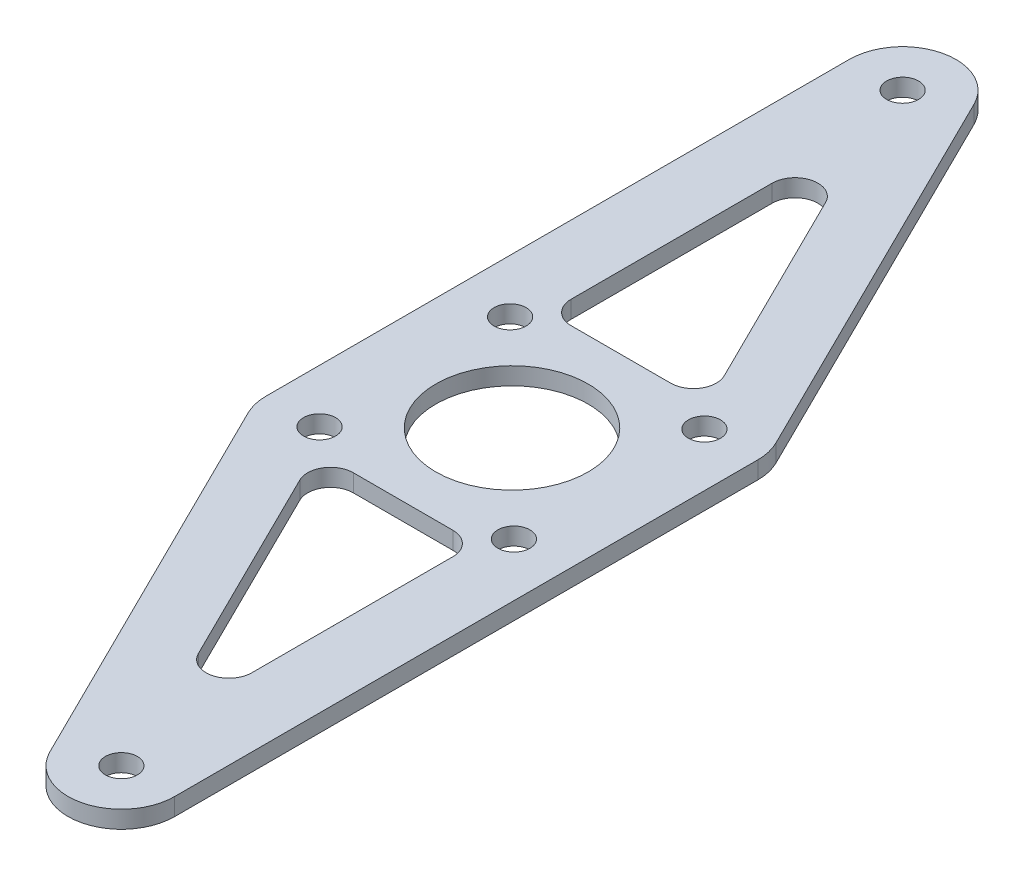
ISO-10303-21;
HEADER;
FILE_DESCRIPTION(('STEP AP214'),'2;1');
FILE_NAME('part.step','',(''),(''),'','','');
FILE_SCHEMA(('AUTOMOTIVE_DESIGN { 1 0 10303 214 1 1 1 1 }'));
ENDSEC;
DATA;
#1=APPLICATION_CONTEXT('core data for automotive mechanical design processes');
#2=APPLICATION_PROTOCOL_DEFINITION('international standard','automotive_design',2000,#1);
#3=PRODUCT_CONTEXT('',#1,'mechanical');
#4=PRODUCT('Part','Part','',(#3));
#5=PRODUCT_RELATED_PRODUCT_CATEGORY('part','',(#4));
#6=PRODUCT_DEFINITION_FORMATION('','',#4);
#7=PRODUCT_DEFINITION_CONTEXT('part definition',#1,'design');
#8=PRODUCT_DEFINITION('design','',#6,#7);
#9=PRODUCT_DEFINITION_SHAPE('','',#8);
#10=(LENGTH_UNIT() NAMED_UNIT(*) SI_UNIT(.MILLI.,.METRE.));
#11=(NAMED_UNIT(*) PLANE_ANGLE_UNIT() SI_UNIT($,.RADIAN.));
#12=(NAMED_UNIT(*) SI_UNIT($,.STERADIAN.) SOLID_ANGLE_UNIT());
#13=UNCERTAINTY_MEASURE_WITH_UNIT(LENGTH_MEASURE(1.E-05),#10,'distance_accuracy_value','');
#14=(GEOMETRIC_REPRESENTATION_CONTEXT(3) GLOBAL_UNCERTAINTY_ASSIGNED_CONTEXT((#13)) GLOBAL_UNIT_ASSIGNED_CONTEXT((#10,
#11,#12)) REPRESENTATION_CONTEXT('',''));
#15=CARTESIAN_POINT('',(0.,0.,0.));
#16=DIRECTION('',(0.,0.,1.));
#17=DIRECTION('',(1.,0.,0.));
#18=AXIS2_PLACEMENT_3D('',#15,#16,#17);
#19=CARTESIAN_POINT('',(-12.7500000000001,-2.286,-64.));
#20=DIRECTION('',(0.,1.,0.));
#21=DIRECTION('',(0.,0.,1.));
#22=AXIS2_PLACEMENT_3D('',#19,#20,#21);
#23=CYLINDRICAL_SURFACE('',#22,7.);
#24=CARTESIAN_POINT('',(-12.7500000000001,0.,-64.));
#25=DIRECTION('',(0.,1.,0.));
#26=DIRECTION('',(0.,0.,-1.));
#27=AXIS2_PLACEMENT_3D('',#24,#25,#26);
#28=CIRCLE('',#27,7.);
#29=CARTESIAN_POINT('',(-6.4768762361764,0.,-67.1061098248051));
#30=VERTEX_POINT('',#29);
#31=CARTESIAN_POINT('',(-19.7500000000001,0.,-63.9999999999993));
#32=VERTEX_POINT('',#31);
#33=EDGE_CURVE('E372',#30,#32,#28,.T.);
#34=ORIENTED_EDGE('',*,*,#33,.F.);
#35=DIRECTION('',(0.,1.,0.));
#36=VECTOR('',#35,1.);
#37=CARTESIAN_POINT('',(-6.4768762361764,-2.286,-67.1061098248051));
#38=LINE('',#37,#36);
#39=CARTESIAN_POINT('',(-6.4768762361764,-2.286,-67.1061098248051));
#40=VERTEX_POINT('',#39);
#41=EDGE_CURVE('E11',#40,#30,#38,.T.);
#42=ORIENTED_EDGE('',*,*,#41,.F.);
#43=CARTESIAN_POINT('',(-12.7500000000001,-2.286,-64.));
#44=DIRECTION('',(0.,1.,0.));
#45=DIRECTION('',(0.,0.,-1.));
#46=AXIS2_PLACEMENT_3D('',#43,#44,#45);
#47=CIRCLE('',#46,7.);
#48=CARTESIAN_POINT('',(-19.7500000000001,-2.286,-63.9999999999993));
#49=VERTEX_POINT('',#48);
#50=EDGE_CURVE('E376',#40,#49,#47,.T.);
#51=ORIENTED_EDGE('',*,*,#50,.T.);
#52=DIRECTION('',(0.,1.,0.));
#53=VECTOR('',#52,1.);
#54=CARTESIAN_POINT('',(-19.7500000000001,-2.286,-63.9999999999993));
#55=LINE('',#54,#53);
#56=EDGE_CURVE('E48',#49,#32,#55,.T.);
#57=ORIENTED_EDGE('',*,*,#56,.T.);
#58=EDGE_LOOP('',(#34,#42,#51,#57));
#59=FACE_BOUND('',#58,.T.);
#60=ADVANCED_FACE('F45',(#59),#23,.T.);
#61=CARTESIAN_POINT('',(-6.4768762361764,-2.286,-67.1061098248051));
#62=DIRECTION('',(0.89616053768905,0.,-0.44372997497225));
#63=DIRECTION('',(-0.44372997497225,0.,-0.89616053768905));
#64=AXIS2_PLACEMENT_3D('',#61,#62,#63);
#65=PLANE('',#64);
#66=DIRECTION('',(-0.44372997497225,0.,-0.89616053768905));
#67=VECTOR('',#66,1.);
#68=CARTESIAN_POINT('',(-6.4768762361764,0.,-67.1061098248051));
#69=LINE('',#68,#67);
#70=CARTESIAN_POINT('',(19.0231237638234,0.,-15.6061098248058));
#71=VERTEX_POINT('',#70);
#72=EDGE_CURVE('E381',#71,#30,#69,.T.);
#73=ORIENTED_EDGE('',*,*,#72,.F.);
#74=DIRECTION('',(0.,1.,0.));
#75=VECTOR('',#74,1.);
#76=CARTESIAN_POINT('',(19.0231237638234,-2.286,-15.6061098248058));
#77=LINE('',#76,#75);
#78=CARTESIAN_POINT('',(19.0231237638234,-2.286,-15.6061098248058));
#79=VERTEX_POINT('',#78);
#80=EDGE_CURVE('E54',#79,#71,#77,.T.);
#81=ORIENTED_EDGE('',*,*,#80,.F.);
#82=DIRECTION('',(-0.44372997497225,0.,-0.89616053768905));
#83=VECTOR('',#82,1.);
#84=CARTESIAN_POINT('',(-6.4768762361764,-2.286,-67.1061098248051));
#85=LINE('',#84,#83);
#86=EDGE_CURVE('E405',#79,#40,#85,.T.);
#87=ORIENTED_EDGE('',*,*,#86,.T.);
#88=ORIENTED_EDGE('',*,*,#41,.T.);
#89=EDGE_LOOP('',(#73,#81,#87,#88));
#90=FACE_BOUND('',#89,.T.);
#91=ADVANCED_FACE('F468',(#90),#65,.T.);
#92=CARTESIAN_POINT('',(12.7499999999999,-2.286,-12.5));
#93=DIRECTION('',(0.,1.,0.));
#94=DIRECTION('',(0.,0.,1.));
#95=AXIS2_PLACEMENT_3D('',#92,#93,#94);
#96=CYLINDRICAL_SURFACE('',#95,7.00000000000016);
#97=CARTESIAN_POINT('',(12.7499999999999,0.,-12.5));
#98=DIRECTION('',(0.,1.,0.));
#99=DIRECTION('',(0.,0.,-1.));
#100=AXIS2_PLACEMENT_3D('',#97,#98,#99);
#101=CIRCLE('',#100,7.00000000000016);
#102=CARTESIAN_POINT('',(19.75,0.,-12.5));
#103=VERTEX_POINT('',#102);
#104=EDGE_CURVE('E432',#103,#71,#101,.T.);
#105=ORIENTED_EDGE('',*,*,#104,.F.);
#106=DIRECTION('',(0.,1.,0.));
#107=VECTOR('',#106,1.);
#108=CARTESIAN_POINT('',(19.75,-2.286,-12.5));
#109=LINE('',#108,#107);
#110=CARTESIAN_POINT('',(19.75,-2.286,-12.5));
#111=VERTEX_POINT('',#110);
#112=EDGE_CURVE('E441',#111,#103,#109,.T.);
#113=ORIENTED_EDGE('',*,*,#112,.F.);
#114=CARTESIAN_POINT('',(12.7499999999999,-2.286,-12.5));
#115=DIRECTION('',(0.,1.,0.));
#116=DIRECTION('',(0.,0.,-1.));
#117=AXIS2_PLACEMENT_3D('',#114,#115,#116);
#118=CIRCLE('',#117,7.00000000000016);
#119=EDGE_CURVE('E401',#111,#79,#118,.T.);
#120=ORIENTED_EDGE('',*,*,#119,.T.);
#121=ORIENTED_EDGE('',*,*,#80,.T.);
#122=EDGE_LOOP('',(#105,#113,#120,#121));
#123=FACE_BOUND('',#122,.T.);
#124=ADVANCED_FACE('F488',(#123),#96,.T.);
#125=CARTESIAN_POINT('',(19.75,-2.286,-12.5));
#126=DIRECTION('',(1.,0.,0.));
#127=DIRECTION('',(0.,0.,-1.));
#128=AXIS2_PLACEMENT_3D('',#125,#126,#127);
#129=PLANE('',#128);
#130=DIRECTION('',(0.,0.,-1.));
#131=VECTOR('',#130,1.);
#132=CARTESIAN_POINT('',(19.75,0.,-12.5));
#133=LINE('',#132,#131);
#134=CARTESIAN_POINT('',(19.75,0.,63.9999999999993));
#135=VERTEX_POINT('',#134);
#136=EDGE_CURVE('E428',#135,#103,#133,.T.);
#137=ORIENTED_EDGE('',*,*,#136,.F.);
#138=DIRECTION('',(0.,1.,0.));
#139=VECTOR('',#138,1.);
#140=CARTESIAN_POINT('',(19.75,-2.286,63.9999999999993));
#141=LINE('',#140,#139);
#142=CARTESIAN_POINT('',(19.75,-2.286,63.9999999999993));
#143=VERTEX_POINT('',#142);
#144=EDGE_CURVE('E444',#143,#135,#141,.T.);
#145=ORIENTED_EDGE('',*,*,#144,.F.);
#146=DIRECTION('',(0.,0.,-1.));
#147=VECTOR('',#146,1.);
#148=CARTESIAN_POINT('',(19.75,-2.286,-12.5));
#149=LINE('',#148,#147);
#150=EDGE_CURVE('E397',#143,#111,#149,.T.);
#151=ORIENTED_EDGE('',*,*,#150,.T.);
#152=ORIENTED_EDGE('',*,*,#112,.T.);
#153=EDGE_LOOP('',(#137,#145,#151,#152));
#154=FACE_BOUND('',#153,.T.);
#155=ADVANCED_FACE('F486',(#154),#129,.T.);
#156=CARTESIAN_POINT('',(12.7499999999999,-2.286,63.9999999999993));
#157=DIRECTION('',(0.,1.,0.));
#158=DIRECTION('',(0.,0.,1.));
#159=AXIS2_PLACEMENT_3D('',#156,#157,#158);
#160=CYLINDRICAL_SURFACE('',#159,7.00000000000016);
#161=CARTESIAN_POINT('',(12.7499999999999,0.,63.9999999999993));
#162=DIRECTION('',(0.,1.,0.));
#163=DIRECTION('',(0.,0.,1.));
#164=AXIS2_PLACEMENT_3D('',#161,#162,#163);
#165=CIRCLE('',#164,7.00000000000016);
#166=CARTESIAN_POINT('',(6.4768762361764,0.,67.1061098248051));
#167=VERTEX_POINT('',#166);
#168=EDGE_CURVE('E424',#167,#135,#165,.T.);
#169=ORIENTED_EDGE('',*,*,#168,.F.);
#170=DIRECTION('',(0.,1.,0.));
#171=VECTOR('',#170,1.);
#172=CARTESIAN_POINT('',(6.4768762361764,-2.286,67.1061098248051));
#173=LINE('',#172,#171);
#174=CARTESIAN_POINT('',(6.4768762361764,-2.286,67.1061098248051));
#175=VERTEX_POINT('',#174);
#176=EDGE_CURVE('E447',#175,#167,#173,.T.);
#177=ORIENTED_EDGE('',*,*,#176,.F.);
#178=CARTESIAN_POINT('',(12.7499999999999,-2.286,63.9999999999993));
#179=DIRECTION('',(0.,1.,0.));
#180=DIRECTION('',(0.,0.,1.));
#181=AXIS2_PLACEMENT_3D('',#178,#179,#180);
#182=CIRCLE('',#181,7.00000000000016);
#183=EDGE_CURVE('E393',#175,#143,#182,.T.);
#184=ORIENTED_EDGE('',*,*,#183,.T.);
#185=ORIENTED_EDGE('',*,*,#144,.T.);
#186=EDGE_LOOP('',(#169,#177,#184,#185));
#187=FACE_BOUND('',#186,.T.);
#188=ADVANCED_FACE('F482',(#187),#160,.T.);
#189=CARTESIAN_POINT('',(6.4768762361764,-2.286,67.1061098248051));
#190=DIRECTION('',(-0.89616053768905,0.,0.44372997497225));
#191=DIRECTION('',(0.44372997497225,0.,0.89616053768905));
#192=AXIS2_PLACEMENT_3D('',#189,#190,#191);
#193=PLANE('',#192);
#194=DIRECTION('',(0.44372997497225,0.,0.89616053768905));
#195=VECTOR('',#194,1.);
#196=CARTESIAN_POINT('',(6.4768762361764,0.,67.1061098248051));
#197=LINE('',#196,#195);
#198=CARTESIAN_POINT('',(-19.0231237638234,0.,15.6061098248058));
#199=VERTEX_POINT('',#198);
#200=EDGE_CURVE('E420',#199,#167,#197,.T.);
#201=ORIENTED_EDGE('',*,*,#200,.F.);
#202=DIRECTION('',(0.,1.,0.));
#203=VECTOR('',#202,1.);
#204=CARTESIAN_POINT('',(-19.0231237638234,-2.286,15.6061098248058));
#205=LINE('',#204,#203);
#206=CARTESIAN_POINT('',(-19.0231237638234,-2.286,15.6061098248058));
#207=VERTEX_POINT('',#206);
#208=EDGE_CURVE('E450',#207,#199,#205,.T.);
#209=ORIENTED_EDGE('',*,*,#208,.F.);
#210=DIRECTION('',(0.44372997497225,0.,0.89616053768905));
#211=VECTOR('',#210,1.);
#212=CARTESIAN_POINT('',(6.4768762361764,-2.286,67.1061098248051));
#213=LINE('',#212,#211);
#214=EDGE_CURVE('E389',#207,#175,#213,.T.);
#215=ORIENTED_EDGE('',*,*,#214,.T.);
#216=ORIENTED_EDGE('',*,*,#176,.T.);
#217=EDGE_LOOP('',(#201,#209,#215,#216));
#218=FACE_BOUND('',#217,.T.);
#219=ADVANCED_FACE('F480',(#218),#193,.T.);
#220=CARTESIAN_POINT('',(-12.7499999999999,-2.286,12.5));
#221=DIRECTION('',(0.,1.,0.));
#222=DIRECTION('',(0.,0.,1.));
#223=AXIS2_PLACEMENT_3D('',#220,#221,#222);
#224=CYLINDRICAL_SURFACE('',#223,7.00000000000016);
#225=CARTESIAN_POINT('',(-12.7499999999999,0.,12.5));
#226=DIRECTION('',(0.,1.,0.));
#227=DIRECTION('',(0.,0.,-1.));
#228=AXIS2_PLACEMENT_3D('',#225,#226,#227);
#229=CIRCLE('',#228,7.00000000000016);
#230=CARTESIAN_POINT('',(-19.7500000000001,0.,12.5));
#231=VERTEX_POINT('',#230);
#232=EDGE_CURVE('E416',#231,#199,#229,.T.);
#233=ORIENTED_EDGE('',*,*,#232,.F.);
#234=DIRECTION('',(0.,1.,0.));
#235=VECTOR('',#234,1.);
#236=CARTESIAN_POINT('',(-19.7500000000001,-2.286,12.5));
#237=LINE('',#236,#235);
#238=CARTESIAN_POINT('',(-19.7500000000001,-2.286,12.5));
#239=VERTEX_POINT('',#238);
#240=EDGE_CURVE('E452',#239,#231,#237,.T.);
#241=ORIENTED_EDGE('',*,*,#240,.F.);
#242=CARTESIAN_POINT('',(-12.7499999999999,-2.286,12.5));
#243=DIRECTION('',(0.,1.,0.));
#244=DIRECTION('',(0.,0.,-1.));
#245=AXIS2_PLACEMENT_3D('',#242,#243,#244);
#246=CIRCLE('',#245,7.00000000000016);
#247=EDGE_CURVE('E385',#239,#207,#246,.T.);
#248=ORIENTED_EDGE('',*,*,#247,.T.);
#249=ORIENTED_EDGE('',*,*,#208,.T.);
#250=EDGE_LOOP('',(#233,#241,#248,#249));
#251=FACE_BOUND('',#250,.T.);
#252=ADVANCED_FACE('F476',(#251),#224,.T.);
#253=CARTESIAN_POINT('',(-19.7500000000001,-2.286,12.5));
#254=DIRECTION('',(-1.,0.,0.));
#255=DIRECTION('',(0.,0.,1.));
#256=AXIS2_PLACEMENT_3D('',#253,#254,#255);
#257=PLANE('',#256);
#258=DIRECTION('',(0.,0.,1.));
#259=VECTOR('',#258,1.);
#260=CARTESIAN_POINT('',(-19.7500000000001,0.,12.5));
#261=LINE('',#260,#259);
#262=EDGE_CURVE('E412',#32,#231,#261,.T.);
#263=ORIENTED_EDGE('',*,*,#262,.F.);
#264=ORIENTED_EDGE('',*,*,#56,.F.);
#265=DIRECTION('',(0.,0.,1.));
#266=VECTOR('',#265,1.);
#267=CARTESIAN_POINT('',(-19.7500000000001,-2.286,12.5));
#268=LINE('',#267,#266);
#269=EDGE_CURVE('E380',#49,#239,#268,.T.);
#270=ORIENTED_EDGE('',*,*,#269,.T.);
#271=ORIENTED_EDGE('',*,*,#240,.T.);
#272=EDGE_LOOP('',(#263,#264,#270,#271));
#273=FACE_BOUND('',#272,.T.);
#274=ADVANCED_FACE('F462',(#273),#257,.T.);
#275=CARTESIAN_POINT('',(-12.7500000000001,-2.286,-64.));
#276=DIRECTION('',(0.,-1.,0.));
#277=DIRECTION('',(0.,0.,-1.));
#278=AXIS2_PLACEMENT_3D('',#275,#276,#277);
#279=PLANE('',#278);
#280=CARTESIAN_POINT('',(7.75000000000005,-2.286,44.8874694819171));
#281=DIRECTION('',(0.,1.,0.));
#282=DIRECTION('',(0.,0.,-1.));
#283=AXIS2_PLACEMENT_3D('',#280,#281,#282);
#284=CIRCLE('',#283,3.);
#285=CARTESIAN_POINT('',(5.0615183869329,-2.286,46.2186594068339));
#286=VERTEX_POINT('',#285);
#287=CARTESIAN_POINT('',(10.75,-2.286,44.8874694819171));
#288=VERTEX_POINT('',#287);
#289=EDGE_CURVE('E185',#286,#288,#284,.T.);
#290=ORIENTED_EDGE('',*,*,#289,.T.);
#291=DIRECTION('',(0.,0.,-1.));
#292=VECTOR('',#291,1.);
#293=CARTESIAN_POINT('',(10.75,-2.286,18.5));
#294=LINE('',#293,#292);
#295=CARTESIAN_POINT('',(10.75,-2.286,18.5));
#296=VERTEX_POINT('',#295);
#297=EDGE_CURVE('E195',#288,#296,#294,.T.);
#298=ORIENTED_EDGE('',*,*,#297,.T.);
#299=CARTESIAN_POINT('',(7.75000000000004,-2.286,18.5));
#300=DIRECTION('',(0.,1.,0.));
#301=DIRECTION('',(0.,0.,1.));
#302=AXIS2_PLACEMENT_3D('',#299,#300,#301);
#303=CIRCLE('',#302,3.);
#304=CARTESIAN_POINT('',(7.75000000000004,-2.286,15.5));
#305=VERTEX_POINT('',#304);
#306=EDGE_CURVE('E62',#296,#305,#303,.T.);
#307=ORIENTED_EDGE('',*,*,#306,.T.);
#308=DIRECTION('',(-1.,0.,0.));
#309=VECTOR('',#308,1.);
#310=CARTESIAN_POINT('',(-5.31564022891046,-2.286,15.5));
#311=LINE('',#310,#309);
#312=CARTESIAN_POINT('',(-5.31564022891046,-2.286,15.5));
#313=VERTEX_POINT('',#312);
#314=EDGE_CURVE('E214',#305,#313,#311,.T.);
#315=ORIENTED_EDGE('',*,*,#314,.T.);
#316=CARTESIAN_POINT('',(-5.31564022891046,-2.286,18.5));
#317=DIRECTION('',(0.,1.,0.));
#318=DIRECTION('',(0.,0.,1.));
#319=AXIS2_PLACEMENT_3D('',#316,#317,#318);
#320=CIRCLE('',#319,3.);
#321=CARTESIAN_POINT('',(-8.00412184197761,-2.286,19.8311899249167));
#322=VERTEX_POINT('',#321);
#323=EDGE_CURVE('E218',#313,#322,#320,.T.);
#324=ORIENTED_EDGE('',*,*,#323,.T.);
#325=DIRECTION('',(0.44372997497225,0.,0.89616053768905));
#326=VECTOR('',#325,1.);
#327=CARTESIAN_POINT('',(5.0615183869329,-2.286,46.2186594068339));
#328=LINE('',#327,#326);
#329=EDGE_CURVE('E192',#322,#286,#328,.T.);
#330=ORIENTED_EDGE('',*,*,#329,.T.);
#331=EDGE_LOOP('',(#290,#298,#307,#315,#324,#330));
#332=FACE_BOUND('',#331,.T.);
#333=CARTESIAN_POINT('',(-7.75000000000004,-2.286,-44.8874694819171));
#334=DIRECTION('',(0.,1.,0.));
#335=DIRECTION('',(0.,0.,-1.));
#336=AXIS2_PLACEMENT_3D('',#333,#334,#335);
#337=CIRCLE('',#336,3.);
#338=CARTESIAN_POINT('',(-5.06151838693289,-2.286,-46.2186594068339));
#339=VERTEX_POINT('',#338);
#340=CARTESIAN_POINT('',(-10.75,-2.286,-44.8874694819171));
#341=VERTEX_POINT('',#340);
#342=EDGE_CURVE('E254',#339,#341,#337,.T.);
#343=ORIENTED_EDGE('',*,*,#342,.T.);
#344=DIRECTION('',(0.,0.,1.));
#345=VECTOR('',#344,1.);
#346=CARTESIAN_POINT('',(-10.75,-2.286,-18.5));
#347=LINE('',#346,#345);
#348=CARTESIAN_POINT('',(-10.75,-2.286,-18.5));
#349=VERTEX_POINT('',#348);
#350=EDGE_CURVE('E258',#341,#349,#347,.T.);
#351=ORIENTED_EDGE('',*,*,#350,.T.);
#352=CARTESIAN_POINT('',(-7.75000000000004,-2.286,-18.5));
#353=DIRECTION('',(0.,1.,0.));
#354=DIRECTION('',(0.,0.,1.));
#355=AXIS2_PLACEMENT_3D('',#352,#353,#354);
#356=CIRCLE('',#355,3.);
#357=CARTESIAN_POINT('',(-7.75000000000004,-2.286,-15.5));
#358=VERTEX_POINT('',#357);
#359=EDGE_CURVE('E263',#349,#358,#356,.T.);
#360=ORIENTED_EDGE('',*,*,#359,.T.);
#361=DIRECTION('',(1.,0.,0.));
#362=VECTOR('',#361,1.);
#363=CARTESIAN_POINT('',(5.31564022891046,-2.286,-15.5));
#364=LINE('',#363,#362);
#365=CARTESIAN_POINT('',(5.31564022891046,-2.286,-15.5));
#366=VERTEX_POINT('',#365);
#367=EDGE_CURVE('E267',#358,#366,#364,.T.);
#368=ORIENTED_EDGE('',*,*,#367,.T.);
#369=CARTESIAN_POINT('',(5.31564022891046,-2.286,-18.5));
#370=DIRECTION('',(0.,1.,0.));
#371=DIRECTION('',(0.,0.,1.));
#372=AXIS2_PLACEMENT_3D('',#369,#370,#371);
#373=CIRCLE('',#372,3.);
#374=CARTESIAN_POINT('',(8.00412184197761,-2.286,-19.8311899249167));
#375=VERTEX_POINT('',#374);
#376=EDGE_CURVE('E271',#366,#375,#373,.T.);
#377=ORIENTED_EDGE('',*,*,#376,.T.);
#378=DIRECTION('',(-0.443729974972249,0.,-0.89616053768905));
#379=VECTOR('',#378,1.);
#380=CARTESIAN_POINT('',(-5.06151838693289,-2.286,-46.2186594068339));
#381=LINE('',#380,#379);
#382=EDGE_CURVE('E275',#375,#339,#381,.T.);
#383=ORIENTED_EDGE('',*,*,#382,.T.);
#384=EDGE_LOOP('',(#343,#351,#360,#368,#377,#383));
#385=FACE_BOUND('',#384,.T.);
#386=CARTESIAN_POINT('',(0.,-2.286,0.));
#387=DIRECTION('',(0.,1.,0.));
#388=DIRECTION('',(0.,0.,1.));
#389=AXIS2_PLACEMENT_3D('',#386,#387,#388);
#390=CIRCLE('',#389,10.);
#391=CARTESIAN_POINT('',(0.,-2.286,10.));
#392=VERTEX_POINT('',#391);
#393=EDGE_CURVE('E320',#392,#392,#390,.T.);
#394=ORIENTED_EDGE('',*,*,#393,.T.);
#395=EDGE_LOOP('',(#394));
#396=FACE_BOUND('',#395,.T.);
#397=CARTESIAN_POINT('',(-12.75,-2.286,12.5));
#398=DIRECTION('',(0.,1.,0.));
#399=DIRECTION('',(0.,0.,1.));
#400=AXIS2_PLACEMENT_3D('',#397,#398,#399);
#401=CIRCLE('',#400,2.1);
#402=CARTESIAN_POINT('',(-12.75,-2.286,14.6));
#403=VERTEX_POINT('',#402);
#404=EDGE_CURVE('E328',#403,#403,#401,.T.);
#405=ORIENTED_EDGE('',*,*,#404,.T.);
#406=EDGE_LOOP('',(#405));
#407=FACE_BOUND('',#406,.T.);
#408=CARTESIAN_POINT('',(12.7500000000001,-2.286,64.));
#409=DIRECTION('',(0.,1.,0.));
#410=DIRECTION('',(0.,0.,1.));
#411=AXIS2_PLACEMENT_3D('',#408,#409,#410);
#412=CIRCLE('',#411,2.1);
#413=CARTESIAN_POINT('',(12.7500000000001,-2.286,66.1));
#414=VERTEX_POINT('',#413);
#415=EDGE_CURVE('E336',#414,#414,#412,.T.);
#416=ORIENTED_EDGE('',*,*,#415,.T.);
#417=EDGE_LOOP('',(#416));
#418=FACE_BOUND('',#417,.T.);
#419=CARTESIAN_POINT('',(12.75,-2.286,12.5));
#420=DIRECTION('',(0.,1.,0.));
#421=DIRECTION('',(0.,0.,1.));
#422=AXIS2_PLACEMENT_3D('',#419,#420,#421);
#423=CIRCLE('',#422,2.1);
#424=CARTESIAN_POINT('',(12.75,-2.286,14.6));
#425=VERTEX_POINT('',#424);
#426=EDGE_CURVE('E344',#425,#425,#423,.T.);
#427=ORIENTED_EDGE('',*,*,#426,.T.);
#428=EDGE_LOOP('',(#427));
#429=FACE_BOUND('',#428,.T.);
#430=CARTESIAN_POINT('',(12.75,-2.286,-12.5));
#431=DIRECTION('',(0.,1.,0.));
#432=DIRECTION('',(0.,0.,1.));
#433=AXIS2_PLACEMENT_3D('',#430,#431,#432);
#434=CIRCLE('',#433,2.1);
#435=CARTESIAN_POINT('',(12.75,-2.286,-10.4));
#436=VERTEX_POINT('',#435);
#437=EDGE_CURVE('E352',#436,#436,#434,.T.);
#438=ORIENTED_EDGE('',*,*,#437,.T.);
#439=EDGE_LOOP('',(#438));
#440=FACE_BOUND('',#439,.T.);
#441=CARTESIAN_POINT('',(-12.75,-2.286,-12.5));
#442=DIRECTION('',(0.,1.,0.));
#443=DIRECTION('',(0.,0.,1.));
#444=AXIS2_PLACEMENT_3D('',#441,#442,#443);
#445=CIRCLE('',#444,2.1);
#446=CARTESIAN_POINT('',(-12.75,-2.286,-10.4));
#447=VERTEX_POINT('',#446);
#448=EDGE_CURVE('E360',#447,#447,#445,.T.);
#449=ORIENTED_EDGE('',*,*,#448,.T.);
#450=EDGE_LOOP('',(#449));
#451=FACE_BOUND('',#450,.T.);
#452=CARTESIAN_POINT('',(-12.7500000000001,-2.286,-64.));
#453=DIRECTION('',(0.,1.,0.));
#454=DIRECTION('',(0.,0.,1.));
#455=AXIS2_PLACEMENT_3D('',#452,#453,#454);
#456=CIRCLE('',#455,2.1);
#457=CARTESIAN_POINT('',(-12.7500000000001,-2.286,-61.9));
#458=VERTEX_POINT('',#457);
#459=EDGE_CURVE('E368',#458,#458,#456,.T.);
#460=ORIENTED_EDGE('',*,*,#459,.T.);
#461=EDGE_LOOP('',(#460));
#462=FACE_BOUND('',#461,.T.);
#463=ORIENTED_EDGE('',*,*,#50,.F.);
#464=ORIENTED_EDGE('',*,*,#86,.F.);
#465=ORIENTED_EDGE('',*,*,#119,.F.);
#466=ORIENTED_EDGE('',*,*,#150,.F.);
#467=ORIENTED_EDGE('',*,*,#183,.F.);
#468=ORIENTED_EDGE('',*,*,#214,.F.);
#469=ORIENTED_EDGE('',*,*,#247,.F.);
#470=ORIENTED_EDGE('',*,*,#269,.F.);
#471=EDGE_LOOP('',(#463,#464,#465,#466,#467,#468,#469,#470));
#472=FACE_BOUND('',#471,.T.);
#473=ADVANCED_FACE('F200',(#332,#385,#396,#407,#418,#429,#440,#451,#462,#472),#279,.T.);
#474=CARTESIAN_POINT('',(-12.7500000000001,0.,-64.));
#475=DIRECTION('',(0.,-1.,0.));
#476=DIRECTION('',(0.,0.,-1.));
#477=AXIS2_PLACEMENT_3D('',#474,#475,#476);
#478=PLANE('',#477);
#479=DIRECTION('',(0.,0.,-1.));
#480=VECTOR('',#479,1.);
#481=CARTESIAN_POINT('',(10.75,0.,18.5));
#482=LINE('',#481,#480);
#483=CARTESIAN_POINT('',(10.75,0.,44.8874694819171));
#484=VERTEX_POINT('',#483);
#485=CARTESIAN_POINT('',(10.75,0.,18.5));
#486=VERTEX_POINT('',#485);
#487=EDGE_CURVE('E225',#484,#486,#482,.T.);
#488=ORIENTED_EDGE('',*,*,#487,.F.);
#489=CARTESIAN_POINT('',(7.75000000000005,0.,44.8874694819171));
#490=DIRECTION('',(0.,1.,0.));
#491=DIRECTION('',(0.,0.,-1.));
#492=AXIS2_PLACEMENT_3D('',#489,#490,#491);
#493=CIRCLE('',#492,3.);
#494=CARTESIAN_POINT('',(5.0615183869329,0.,46.2186594068339));
#495=VERTEX_POINT('',#494);
#496=EDGE_CURVE('E70',#495,#484,#493,.T.);
#497=ORIENTED_EDGE('',*,*,#496,.F.);
#498=DIRECTION('',(0.44372997497225,0.,0.89616053768905));
#499=VECTOR('',#498,1.);
#500=CARTESIAN_POINT('',(5.0615183869329,0.,46.2186594068339));
#501=LINE('',#500,#499);
#502=CARTESIAN_POINT('',(-8.00412184197761,0.,19.8311899249167));
#503=VERTEX_POINT('',#502);
#504=EDGE_CURVE('E205',#503,#495,#501,.T.);
#505=ORIENTED_EDGE('',*,*,#504,.F.);
#506=CARTESIAN_POINT('',(-5.31564022891046,0.,18.5));
#507=DIRECTION('',(0.,1.,0.));
#508=DIRECTION('',(0.,0.,1.));
#509=AXIS2_PLACEMENT_3D('',#506,#507,#508);
#510=CIRCLE('',#509,3.);
#511=CARTESIAN_POINT('',(-5.31564022891046,0.,15.5));
#512=VERTEX_POINT('',#511);
#513=EDGE_CURVE('E209',#512,#503,#510,.T.);
#514=ORIENTED_EDGE('',*,*,#513,.F.);
#515=DIRECTION('',(-1.,0.,0.));
#516=VECTOR('',#515,1.);
#517=CARTESIAN_POINT('',(-5.31564022891046,0.,15.5));
#518=LINE('',#517,#516);
#519=CARTESIAN_POINT('',(7.75000000000004,0.,15.5));
#520=VERTEX_POINT('',#519);
#521=EDGE_CURVE('E232',#520,#512,#518,.T.);
#522=ORIENTED_EDGE('',*,*,#521,.F.);
#523=CARTESIAN_POINT('',(7.75000000000004,0.,18.5));
#524=DIRECTION('',(0.,1.,0.));
#525=DIRECTION('',(0.,0.,1.));
#526=AXIS2_PLACEMENT_3D('',#523,#524,#525);
#527=CIRCLE('',#526,3.);
#528=EDGE_CURVE('E228',#486,#520,#527,.T.);
#529=ORIENTED_EDGE('',*,*,#528,.F.);
#530=EDGE_LOOP('',(#488,#497,#505,#514,#522,#529));
#531=FACE_BOUND('',#530,.T.);
#532=DIRECTION('',(0.,0.,1.));
#533=VECTOR('',#532,1.);
#534=CARTESIAN_POINT('',(-10.75,0.,-18.5));
#535=LINE('',#534,#533);
#536=CARTESIAN_POINT('',(-10.75,0.,-44.8874694819171));
#537=VERTEX_POINT('',#536);
#538=CARTESIAN_POINT('',(-10.75,0.,-18.5));
#539=VERTEX_POINT('',#538);
#540=EDGE_CURVE('E282',#537,#539,#535,.T.);
#541=ORIENTED_EDGE('',*,*,#540,.F.);
#542=CARTESIAN_POINT('',(-7.75000000000004,0.,-44.8874694819171));
#543=DIRECTION('',(0.,1.,0.));
#544=DIRECTION('',(0.,0.,-1.));
#545=AXIS2_PLACEMENT_3D('',#542,#543,#544);
#546=CIRCLE('',#545,3.);
#547=CARTESIAN_POINT('',(-5.06151838693289,0.,-46.2186594068339));
#548=VERTEX_POINT('',#547);
#549=EDGE_CURVE('E242',#548,#537,#546,.T.);
#550=ORIENTED_EDGE('',*,*,#549,.F.);
#551=DIRECTION('',(-0.443729974972249,0.,-0.89616053768905));
#552=VECTOR('',#551,1.);
#553=CARTESIAN_POINT('',(-5.06151838693289,0.,-46.2186594068339));
#554=LINE('',#553,#552);
#555=CARTESIAN_POINT('',(8.00412184197761,0.,-19.8311899249167));
#556=VERTEX_POINT('',#555);
#557=EDGE_CURVE('E259',#556,#548,#554,.T.);
#558=ORIENTED_EDGE('',*,*,#557,.F.);
#559=CARTESIAN_POINT('',(5.31564022891046,0.,-18.5));
#560=DIRECTION('',(0.,1.,0.));
#561=DIRECTION('',(0.,0.,1.));
#562=AXIS2_PLACEMENT_3D('',#559,#560,#561);
#563=CIRCLE('',#562,3.);
#564=CARTESIAN_POINT('',(5.31564022891046,0.,-15.5));
#565=VERTEX_POINT('',#564);
#566=EDGE_CURVE('E294',#565,#556,#563,.T.);
#567=ORIENTED_EDGE('',*,*,#566,.F.);
#568=DIRECTION('',(1.,0.,0.));
#569=VECTOR('',#568,1.);
#570=CARTESIAN_POINT('',(5.31564022891046,0.,-15.5));
#571=LINE('',#570,#569);
#572=CARTESIAN_POINT('',(-7.75000000000004,0.,-15.5));
#573=VERTEX_POINT('',#572);
#574=EDGE_CURVE('E290',#573,#565,#571,.T.);
#575=ORIENTED_EDGE('',*,*,#574,.F.);
#576=CARTESIAN_POINT('',(-7.75000000000004,0.,-18.5));
#577=DIRECTION('',(0.,1.,0.));
#578=DIRECTION('',(0.,0.,1.));
#579=AXIS2_PLACEMENT_3D('',#576,#577,#578);
#580=CIRCLE('',#579,3.);
#581=EDGE_CURVE('E286',#539,#573,#580,.T.);
#582=ORIENTED_EDGE('',*,*,#581,.F.);
#583=EDGE_LOOP('',(#541,#550,#558,#567,#575,#582));
#584=FACE_BOUND('',#583,.T.);
#585=CARTESIAN_POINT('',(0.,0.,0.));
#586=DIRECTION('',(0.,1.,0.));
#587=DIRECTION('',(0.,0.,1.));
#588=AXIS2_PLACEMENT_3D('',#585,#586,#587);
#589=CIRCLE('',#588,10.);
#590=CARTESIAN_POINT('',(0.,0.,10.));
#591=VERTEX_POINT('',#590);
#592=EDGE_CURVE('E304',#591,#591,#589,.T.);
#593=ORIENTED_EDGE('',*,*,#592,.F.);
#594=EDGE_LOOP('',(#593));
#595=FACE_BOUND('',#594,.T.);
#596=CARTESIAN_POINT('',(-12.75,0.,12.5));
#597=DIRECTION('',(0.,1.,0.));
#598=DIRECTION('',(0.,0.,1.));
#599=AXIS2_PLACEMENT_3D('',#596,#597,#598);
#600=CIRCLE('',#599,2.1);
#601=CARTESIAN_POINT('',(-12.75,0.,14.6));
#602=VERTEX_POINT('',#601);
#603=EDGE_CURVE('E324',#602,#602,#600,.T.);
#604=ORIENTED_EDGE('',*,*,#603,.F.);
#605=EDGE_LOOP('',(#604));
#606=FACE_BOUND('',#605,.T.);
#607=CARTESIAN_POINT('',(12.7500000000001,0.,64.));
#608=DIRECTION('',(0.,1.,0.));
#609=DIRECTION('',(0.,0.,1.));
#610=AXIS2_PLACEMENT_3D('',#607,#608,#609);
#611=CIRCLE('',#610,2.1);
#612=CARTESIAN_POINT('',(12.7500000000001,0.,66.1));
#613=VERTEX_POINT('',#612);
#614=EDGE_CURVE('E332',#613,#613,#611,.T.);
#615=ORIENTED_EDGE('',*,*,#614,.F.);
#616=EDGE_LOOP('',(#615));
#617=FACE_BOUND('',#616,.T.);
#618=CARTESIAN_POINT('',(12.75,0.,12.5));
#619=DIRECTION('',(0.,1.,0.));
#620=DIRECTION('',(0.,0.,1.));
#621=AXIS2_PLACEMENT_3D('',#618,#619,#620);
#622=CIRCLE('',#621,2.1);
#623=CARTESIAN_POINT('',(12.75,0.,14.6));
#624=VERTEX_POINT('',#623);
#625=EDGE_CURVE('E340',#624,#624,#622,.T.);
#626=ORIENTED_EDGE('',*,*,#625,.F.);
#627=EDGE_LOOP('',(#626));
#628=FACE_BOUND('',#627,.T.);
#629=CARTESIAN_POINT('',(12.75,0.,-12.5));
#630=DIRECTION('',(0.,1.,0.));
#631=DIRECTION('',(0.,0.,1.));
#632=AXIS2_PLACEMENT_3D('',#629,#630,#631);
#633=CIRCLE('',#632,2.1);
#634=CARTESIAN_POINT('',(12.75,0.,-10.4));
#635=VERTEX_POINT('',#634);
#636=EDGE_CURVE('E348',#635,#635,#633,.T.);
#637=ORIENTED_EDGE('',*,*,#636,.F.);
#638=EDGE_LOOP('',(#637));
#639=FACE_BOUND('',#638,.T.);
#640=CARTESIAN_POINT('',(-12.75,0.,-12.5));
#641=DIRECTION('',(0.,1.,0.));
#642=DIRECTION('',(0.,0.,1.));
#643=AXIS2_PLACEMENT_3D('',#640,#641,#642);
#644=CIRCLE('',#643,2.1);
#645=CARTESIAN_POINT('',(-12.75,0.,-10.4));
#646=VERTEX_POINT('',#645);
#647=EDGE_CURVE('E356',#646,#646,#644,.T.);
#648=ORIENTED_EDGE('',*,*,#647,.F.);
#649=EDGE_LOOP('',(#648));
#650=FACE_BOUND('',#649,.T.);
#651=CARTESIAN_POINT('',(-12.7500000000001,0.,-64.));
#652=DIRECTION('',(0.,1.,0.));
#653=DIRECTION('',(0.,0.,1.));
#654=AXIS2_PLACEMENT_3D('',#651,#652,#653);
#655=CIRCLE('',#654,2.1);
#656=CARTESIAN_POINT('',(-12.7500000000001,0.,-61.9));
#657=VERTEX_POINT('',#656);
#658=EDGE_CURVE('E364',#657,#657,#655,.T.);
#659=ORIENTED_EDGE('',*,*,#658,.F.);
#660=EDGE_LOOP('',(#659));
#661=FACE_BOUND('',#660,.T.);
#662=ORIENTED_EDGE('',*,*,#33,.T.);
#663=ORIENTED_EDGE('',*,*,#262,.T.);
#664=ORIENTED_EDGE('',*,*,#232,.T.);
#665=ORIENTED_EDGE('',*,*,#200,.T.);
#666=ORIENTED_EDGE('',*,*,#168,.T.);
#667=ORIENTED_EDGE('',*,*,#136,.T.);
#668=ORIENTED_EDGE('',*,*,#104,.T.);
#669=ORIENTED_EDGE('',*,*,#72,.T.);
#670=EDGE_LOOP('',(#662,#663,#664,#665,#666,#667,#668,#669));
#671=FACE_BOUND('',#670,.T.);
#672=ADVANCED_FACE('F464',(#531,#584,#595,#606,#617,#628,#639,#650,#661,#671),#478,.F.);
#673=CARTESIAN_POINT('',(-12.7500000000001,-2.286,-64.));
#674=DIRECTION('',(0.,1.,0.));
#675=DIRECTION('',(0.,0.,1.));
#676=AXIS2_PLACEMENT_3D('',#673,#674,#675);
#677=CYLINDRICAL_SURFACE('',#676,2.1);
#678=ORIENTED_EDGE('',*,*,#459,.F.);
#679=EDGE_LOOP('',(#678));
#680=FACE_BOUND('',#679,.T.);
#681=ORIENTED_EDGE('',*,*,#658,.T.);
#682=EDGE_LOOP('',(#681));
#683=FACE_BOUND('',#682,.T.);
#684=ADVANCED_FACE('F564',(#680,#683),#677,.F.);
#685=CARTESIAN_POINT('',(-12.75,-2.286,-12.5));
#686=DIRECTION('',(0.,1.,0.));
#687=DIRECTION('',(0.,0.,1.));
#688=AXIS2_PLACEMENT_3D('',#685,#686,#687);
#689=CYLINDRICAL_SURFACE('',#688,2.1);
#690=ORIENTED_EDGE('',*,*,#448,.F.);
#691=EDGE_LOOP('',(#690));
#692=FACE_BOUND('',#691,.T.);
#693=ORIENTED_EDGE('',*,*,#647,.T.);
#694=EDGE_LOOP('',(#693));
#695=FACE_BOUND('',#694,.T.);
#696=ADVANCED_FACE('F574',(#692,#695),#689,.F.);
#697=CARTESIAN_POINT('',(12.75,-2.286,-12.5));
#698=DIRECTION('',(0.,1.,0.));
#699=DIRECTION('',(0.,0.,1.));
#700=AXIS2_PLACEMENT_3D('',#697,#698,#699);
#701=CYLINDRICAL_SURFACE('',#700,2.1);
#702=ORIENTED_EDGE('',*,*,#437,.F.);
#703=EDGE_LOOP('',(#702));
#704=FACE_BOUND('',#703,.T.);
#705=ORIENTED_EDGE('',*,*,#636,.T.);
#706=EDGE_LOOP('',(#705));
#707=FACE_BOUND('',#706,.T.);
#708=ADVANCED_FACE('F584',(#704,#707),#701,.F.);
#709=CARTESIAN_POINT('',(12.75,-2.286,12.5));
#710=DIRECTION('',(0.,1.,0.));
#711=DIRECTION('',(0.,0.,1.));
#712=AXIS2_PLACEMENT_3D('',#709,#710,#711);
#713=CYLINDRICAL_SURFACE('',#712,2.1);
#714=ORIENTED_EDGE('',*,*,#426,.F.);
#715=EDGE_LOOP('',(#714));
#716=FACE_BOUND('',#715,.T.);
#717=ORIENTED_EDGE('',*,*,#625,.T.);
#718=EDGE_LOOP('',(#717));
#719=FACE_BOUND('',#718,.T.);
#720=ADVANCED_FACE('F594',(#716,#719),#713,.F.);
#721=CARTESIAN_POINT('',(12.7500000000001,-2.286,64.));
#722=DIRECTION('',(0.,1.,0.));
#723=DIRECTION('',(0.,0.,1.));
#724=AXIS2_PLACEMENT_3D('',#721,#722,#723);
#725=CYLINDRICAL_SURFACE('',#724,2.1);
#726=ORIENTED_EDGE('',*,*,#415,.F.);
#727=EDGE_LOOP('',(#726));
#728=FACE_BOUND('',#727,.T.);
#729=ORIENTED_EDGE('',*,*,#614,.T.);
#730=EDGE_LOOP('',(#729));
#731=FACE_BOUND('',#730,.T.);
#732=ADVANCED_FACE('F604',(#728,#731),#725,.F.);
#733=CARTESIAN_POINT('',(-12.75,-2.286,12.5));
#734=DIRECTION('',(0.,1.,0.));
#735=DIRECTION('',(0.,0.,1.));
#736=AXIS2_PLACEMENT_3D('',#733,#734,#735);
#737=CYLINDRICAL_SURFACE('',#736,2.1);
#738=ORIENTED_EDGE('',*,*,#404,.F.);
#739=EDGE_LOOP('',(#738));
#740=FACE_BOUND('',#739,.T.);
#741=ORIENTED_EDGE('',*,*,#603,.T.);
#742=EDGE_LOOP('',(#741));
#743=FACE_BOUND('',#742,.T.);
#744=ADVANCED_FACE('F614',(#740,#743),#737,.F.);
#745=CARTESIAN_POINT('',(0.,-2.286,0.));
#746=DIRECTION('',(0.,1.,0.));
#747=DIRECTION('',(0.,0.,1.));
#748=AXIS2_PLACEMENT_3D('',#745,#746,#747);
#749=CYLINDRICAL_SURFACE('',#748,10.);
#750=ORIENTED_EDGE('',*,*,#393,.F.);
#751=EDGE_LOOP('',(#750));
#752=FACE_BOUND('',#751,.T.);
#753=ORIENTED_EDGE('',*,*,#592,.T.);
#754=EDGE_LOOP('',(#753));
#755=FACE_BOUND('',#754,.T.);
#756=ADVANCED_FACE('F624',(#752,#755),#749,.F.);
#757=CARTESIAN_POINT('',(-7.75000000000004,-2.286,-44.8874694819171));
#758=DIRECTION('',(0.,1.,0.));
#759=DIRECTION('',(0.,0.,1.));
#760=AXIS2_PLACEMENT_3D('',#757,#758,#759);
#761=CYLINDRICAL_SURFACE('',#760,3.);
#762=ORIENTED_EDGE('',*,*,#549,.T.);
#763=DIRECTION('',(0.,1.,0.));
#764=VECTOR('',#763,1.);
#765=CARTESIAN_POINT('',(-10.75,-2.286,-44.8874694819171));
#766=LINE('',#765,#764);
#767=EDGE_CURVE('E279',#341,#537,#766,.T.);
#768=ORIENTED_EDGE('',*,*,#767,.F.);
#769=ORIENTED_EDGE('',*,*,#342,.F.);
#770=DIRECTION('',(0.,1.,0.));
#771=VECTOR('',#770,1.);
#772=CARTESIAN_POINT('',(-5.06151838693289,-2.286,-46.2186594068339));
#773=LINE('',#772,#771);
#774=EDGE_CURVE('E301',#339,#548,#773,.T.);
#775=ORIENTED_EDGE('',*,*,#774,.T.);
#776=EDGE_LOOP('',(#762,#768,#769,#775));
#777=FACE_BOUND('',#776,.T.);
#778=ADVANCED_FACE('F634',(#777),#761,.F.);
#779=CARTESIAN_POINT('',(-5.06151838693289,-2.286,-46.2186594068339));
#780=DIRECTION('',(0.89616053768905,0.,-0.443729974972249));
#781=DIRECTION('',(-0.44372997497225,0.,-0.89616053768905));
#782=AXIS2_PLACEMENT_3D('',#779,#780,#781);
#783=PLANE('',#782);
#784=ORIENTED_EDGE('',*,*,#557,.T.);
#785=ORIENTED_EDGE('',*,*,#774,.F.);
#786=ORIENTED_EDGE('',*,*,#382,.F.);
#787=DIRECTION('',(0.,1.,0.));
#788=VECTOR('',#787,1.);
#789=CARTESIAN_POINT('',(8.00412184197761,-2.286,-19.8311899249167));
#790=LINE('',#789,#788);
#791=EDGE_CURVE('E305',#375,#556,#790,.T.);
#792=ORIENTED_EDGE('',*,*,#791,.T.);
#793=EDGE_LOOP('',(#784,#785,#786,#792));
#794=FACE_BOUND('',#793,.T.);
#795=ADVANCED_FACE('F644',(#794),#783,.F.);
#796=CARTESIAN_POINT('',(5.31564022891046,-2.286,-18.5));
#797=DIRECTION('',(0.,1.,0.));
#798=DIRECTION('',(0.,0.,1.));
#799=AXIS2_PLACEMENT_3D('',#796,#797,#798);
#800=CYLINDRICAL_SURFACE('',#799,3.);
#801=ORIENTED_EDGE('',*,*,#566,.T.);
#802=ORIENTED_EDGE('',*,*,#791,.F.);
#803=ORIENTED_EDGE('',*,*,#376,.F.);
#804=DIRECTION('',(0.,1.,0.));
#805=VECTOR('',#804,1.);
#806=CARTESIAN_POINT('',(5.31564022891046,-2.286,-15.5));
#807=LINE('',#806,#805);
#808=EDGE_CURVE('E308',#366,#565,#807,.T.);
#809=ORIENTED_EDGE('',*,*,#808,.T.);
#810=EDGE_LOOP('',(#801,#802,#803,#809));
#811=FACE_BOUND('',#810,.T.);
#812=ADVANCED_FACE('F654',(#811),#800,.F.);
#813=CARTESIAN_POINT('',(5.31564022891046,-2.286,-15.5));
#814=DIRECTION('',(0.,0.,1.));
#815=DIRECTION('',(1.,0.,0.));
#816=AXIS2_PLACEMENT_3D('',#813,#814,#815);
#817=PLANE('',#816);
#818=ORIENTED_EDGE('',*,*,#574,.T.);
#819=ORIENTED_EDGE('',*,*,#808,.F.);
#820=ORIENTED_EDGE('',*,*,#367,.F.);
#821=DIRECTION('',(0.,1.,0.));
#822=VECTOR('',#821,1.);
#823=CARTESIAN_POINT('',(-7.75000000000004,-2.286,-15.5));
#824=LINE('',#823,#822);
#825=EDGE_CURVE('E311',#358,#573,#824,.T.);
#826=ORIENTED_EDGE('',*,*,#825,.T.);
#827=EDGE_LOOP('',(#818,#819,#820,#826));
#828=FACE_BOUND('',#827,.T.);
#829=ADVANCED_FACE('F664',(#828),#817,.F.);
#830=CARTESIAN_POINT('',(-7.75000000000004,-2.286,-18.5));
#831=DIRECTION('',(0.,1.,0.));
#832=DIRECTION('',(0.,0.,1.));
#833=AXIS2_PLACEMENT_3D('',#830,#831,#832);
#834=CYLINDRICAL_SURFACE('',#833,3.);
#835=ORIENTED_EDGE('',*,*,#581,.T.);
#836=ORIENTED_EDGE('',*,*,#825,.F.);
#837=ORIENTED_EDGE('',*,*,#359,.F.);
#838=DIRECTION('',(0.,1.,0.));
#839=VECTOR('',#838,1.);
#840=CARTESIAN_POINT('',(-10.75,-2.286,-18.5));
#841=LINE('',#840,#839);
#842=EDGE_CURVE('E314',#349,#539,#841,.T.);
#843=ORIENTED_EDGE('',*,*,#842,.T.);
#844=EDGE_LOOP('',(#835,#836,#837,#843));
#845=FACE_BOUND('',#844,.T.);
#846=ADVANCED_FACE('F674',(#845),#834,.F.);
#847=CARTESIAN_POINT('',(-10.75,-2.286,-18.5));
#848=DIRECTION('',(-1.,0.,0.));
#849=DIRECTION('',(0.,0.,1.));
#850=AXIS2_PLACEMENT_3D('',#847,#848,#849);
#851=PLANE('',#850);
#852=ORIENTED_EDGE('',*,*,#540,.T.);
#853=ORIENTED_EDGE('',*,*,#842,.F.);
#854=ORIENTED_EDGE('',*,*,#350,.F.);
#855=ORIENTED_EDGE('',*,*,#767,.T.);
#856=EDGE_LOOP('',(#852,#853,#854,#855));
#857=FACE_BOUND('',#856,.T.);
#858=ADVANCED_FACE('F684',(#857),#851,.F.);
#859=CARTESIAN_POINT('',(7.75000000000005,-2.286,44.8874694819171));
#860=DIRECTION('',(0.,1.,0.));
#861=DIRECTION('',(0.,0.,1.));
#862=AXIS2_PLACEMENT_3D('',#859,#860,#861);
#863=CYLINDRICAL_SURFACE('',#862,3.);
#864=ORIENTED_EDGE('',*,*,#496,.T.);
#865=DIRECTION('',(0.,1.,0.));
#866=VECTOR('',#865,1.);
#867=CARTESIAN_POINT('',(10.75,-2.286,44.8874694819171));
#868=LINE('',#867,#866);
#869=EDGE_CURVE('E181',#288,#484,#868,.T.);
#870=ORIENTED_EDGE('',*,*,#869,.F.);
#871=ORIENTED_EDGE('',*,*,#289,.F.);
#872=DIRECTION('',(0.,1.,0.));
#873=VECTOR('',#872,1.);
#874=CARTESIAN_POINT('',(5.0615183869329,-2.286,46.2186594068339));
#875=LINE('',#874,#873);
#876=EDGE_CURVE('E239',#286,#495,#875,.T.);
#877=ORIENTED_EDGE('',*,*,#876,.T.);
#878=EDGE_LOOP('',(#864,#870,#871,#877));
#879=FACE_BOUND('',#878,.T.);
#880=ADVANCED_FACE('F183',(#879),#863,.F.);
#881=CARTESIAN_POINT('',(5.0615183869329,-2.286,46.2186594068339));
#882=DIRECTION('',(-0.89616053768905,0.,0.44372997497225));
#883=DIRECTION('',(0.44372997497225,0.,0.89616053768905));
#884=AXIS2_PLACEMENT_3D('',#881,#882,#883);
#885=PLANE('',#884);
#886=ORIENTED_EDGE('',*,*,#504,.T.);
#887=ORIENTED_EDGE('',*,*,#876,.F.);
#888=ORIENTED_EDGE('',*,*,#329,.F.);
#889=DIRECTION('',(0.,1.,0.));
#890=VECTOR('',#889,1.);
#891=CARTESIAN_POINT('',(-8.00412184197761,-2.286,19.8311899249167));
#892=LINE('',#891,#890);
#893=EDGE_CURVE('E243',#322,#503,#892,.T.);
#894=ORIENTED_EDGE('',*,*,#893,.T.);
#895=EDGE_LOOP('',(#886,#887,#888,#894));
#896=FACE_BOUND('',#895,.T.);
#897=ADVANCED_FACE('F703',(#896),#885,.F.);
#898=CARTESIAN_POINT('',(-5.31564022891046,-2.286,18.5));
#899=DIRECTION('',(0.,1.,0.));
#900=DIRECTION('',(0.,0.,1.));
#901=AXIS2_PLACEMENT_3D('',#898,#899,#900);
#902=CYLINDRICAL_SURFACE('',#901,3.);
#903=ORIENTED_EDGE('',*,*,#513,.T.);
#904=ORIENTED_EDGE('',*,*,#893,.F.);
#905=ORIENTED_EDGE('',*,*,#323,.F.);
#906=DIRECTION('',(0.,1.,0.));
#907=VECTOR('',#906,1.);
#908=CARTESIAN_POINT('',(-5.31564022891046,-2.286,15.5));
#909=LINE('',#908,#907);
#910=EDGE_CURVE('E246',#313,#512,#909,.T.);
#911=ORIENTED_EDGE('',*,*,#910,.T.);
#912=EDGE_LOOP('',(#903,#904,#905,#911));
#913=FACE_BOUND('',#912,.T.);
#914=ADVANCED_FACE('F712',(#913),#902,.F.);
#915=CARTESIAN_POINT('',(-5.31564022891046,-2.286,15.5));
#916=DIRECTION('',(0.,0.,-1.));
#917=DIRECTION('',(-1.,0.,0.));
#918=AXIS2_PLACEMENT_3D('',#915,#916,#917);
#919=PLANE('',#918);
#920=ORIENTED_EDGE('',*,*,#521,.T.);
#921=ORIENTED_EDGE('',*,*,#910,.F.);
#922=ORIENTED_EDGE('',*,*,#314,.F.);
#923=DIRECTION('',(0.,1.,0.));
#924=VECTOR('',#923,1.);
#925=CARTESIAN_POINT('',(7.75000000000004,-2.286,15.5));
#926=LINE('',#925,#924);
#927=EDGE_CURVE('E249',#305,#520,#926,.T.);
#928=ORIENTED_EDGE('',*,*,#927,.T.);
#929=EDGE_LOOP('',(#920,#921,#922,#928));
#930=FACE_BOUND('',#929,.T.);
#931=ADVANCED_FACE('F722',(#930),#919,.F.);
#932=CARTESIAN_POINT('',(7.75000000000004,-2.286,18.5));
#933=DIRECTION('',(0.,1.,0.));
#934=DIRECTION('',(0.,0.,1.));
#935=AXIS2_PLACEMENT_3D('',#932,#933,#934);
#936=CYLINDRICAL_SURFACE('',#935,3.);
#937=ORIENTED_EDGE('',*,*,#528,.T.);
#938=ORIENTED_EDGE('',*,*,#927,.F.);
#939=ORIENTED_EDGE('',*,*,#306,.F.);
#940=DIRECTION('',(0.,1.,0.));
#941=VECTOR('',#940,1.);
#942=CARTESIAN_POINT('',(10.75,-2.286,18.5));
#943=LINE('',#942,#941);
#944=EDGE_CURVE('E191',#296,#486,#943,.T.);
#945=ORIENTED_EDGE('',*,*,#944,.T.);
#946=EDGE_LOOP('',(#937,#938,#939,#945));
#947=FACE_BOUND('',#946,.T.);
#948=ADVANCED_FACE('F732',(#947),#936,.F.);
#949=CARTESIAN_POINT('',(10.75,-2.286,18.5));
#950=DIRECTION('',(1.,0.,0.));
#951=DIRECTION('',(0.,0.,-1.));
#952=AXIS2_PLACEMENT_3D('',#949,#950,#951);
#953=PLANE('',#952);
#954=ORIENTED_EDGE('',*,*,#487,.T.);
#955=ORIENTED_EDGE('',*,*,#944,.F.);
#956=ORIENTED_EDGE('',*,*,#297,.F.);
#957=ORIENTED_EDGE('',*,*,#869,.T.);
#958=EDGE_LOOP('',(#954,#955,#956,#957));
#959=FACE_BOUND('',#958,.T.);
#960=ADVANCED_FACE('F196',(#959),#953,.F.);
#961=CLOSED_SHELL('',(#60,#91,#124,#155,#188,#219,#252,#274,#473,#672,#684,#696,#708,#720,#732,
#744,#756,#778,#795,#812,#829,#846,#858,#880,#897,#914,#931,#948,#960));
#962=MANIFOLD_SOLID_BREP('B2',#961);
#963=ADVANCED_BREP_SHAPE_REPRESENTATION('',(#18,#962),#14);
#964=SHAPE_DEFINITION_REPRESENTATION(#9,#963);
ENDSEC;
END-ISO-10303-21;
